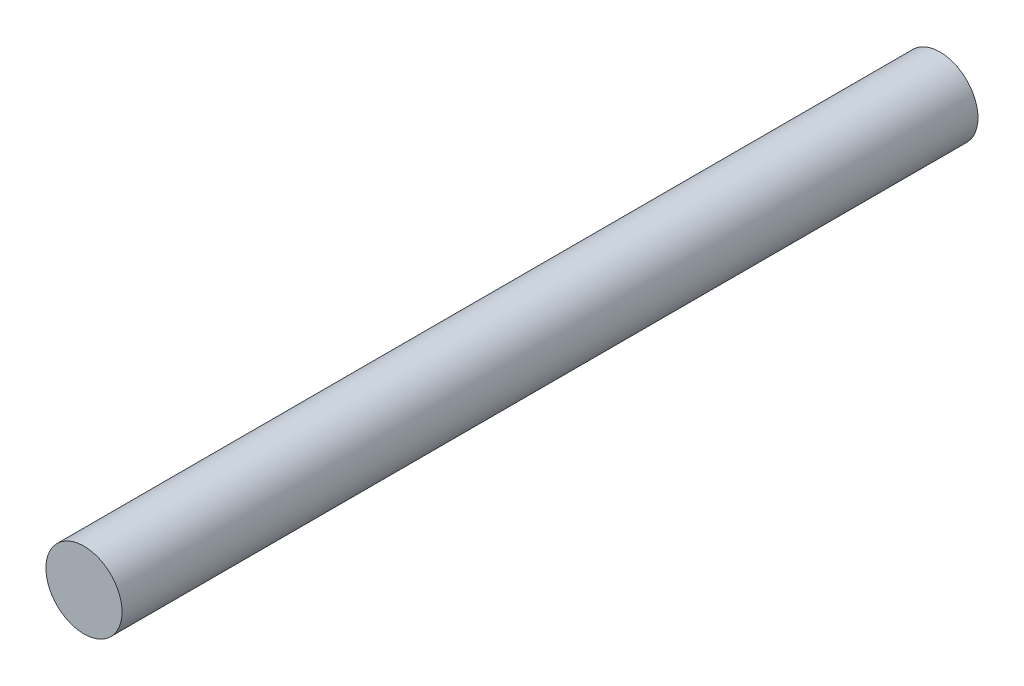
ISO-10303-21;
HEADER;
FILE_DESCRIPTION(('STEP AP214'),'2;1');
FILE_NAME('part.step','',(''),(''),'','','');
FILE_SCHEMA(('AUTOMOTIVE_DESIGN { 1 0 10303 214 1 1 1 1 }'));
ENDSEC;
DATA;
#1=APPLICATION_CONTEXT('core data for automotive mechanical design processes');
#2=APPLICATION_PROTOCOL_DEFINITION('international standard','automotive_design',2000,#1);
#3=PRODUCT_CONTEXT('',#1,'mechanical');
#4=PRODUCT('Part','Part','',(#3));
#5=PRODUCT_RELATED_PRODUCT_CATEGORY('part','',(#4));
#6=PRODUCT_DEFINITION_FORMATION('','',#4);
#7=PRODUCT_DEFINITION_CONTEXT('part definition',#1,'design');
#8=PRODUCT_DEFINITION('design','',#6,#7);
#9=PRODUCT_DEFINITION_SHAPE('','',#8);
#10=(LENGTH_UNIT() NAMED_UNIT(*) SI_UNIT(.MILLI.,.METRE.));
#11=(NAMED_UNIT(*) PLANE_ANGLE_UNIT() SI_UNIT($,.RADIAN.));
#12=(NAMED_UNIT(*) SI_UNIT($,.STERADIAN.) SOLID_ANGLE_UNIT());
#13=UNCERTAINTY_MEASURE_WITH_UNIT(LENGTH_MEASURE(1.E-05),#10,'distance_accuracy_value','');
#14=(GEOMETRIC_REPRESENTATION_CONTEXT(3) GLOBAL_UNCERTAINTY_ASSIGNED_CONTEXT((#13)) GLOBAL_UNIT_ASSIGNED_CONTEXT((#10,
#11,#12)) REPRESENTATION_CONTEXT('',''));
#15=CARTESIAN_POINT('',(0.,0.,0.));
#16=DIRECTION('',(0.,0.,1.));
#17=DIRECTION('',(1.,0.,0.));
#18=AXIS2_PLACEMENT_3D('',#15,#16,#17);
#19=CARTESIAN_POINT('',(0.,0.,112.5));
#20=DIRECTION('',(0.,0.,-1.));
#21=DIRECTION('',(-1.,0.,0.));
#22=AXIS2_PLACEMENT_3D('',#19,#20,#21);
#23=CYLINDRICAL_SURFACE('',#22,10.);
#24=CARTESIAN_POINT('',(0.,0.,112.5));
#25=DIRECTION('',(0.,0.,1.));
#26=DIRECTION('',(1.,0.,0.));
#27=AXIS2_PLACEMENT_3D('',#24,#25,#26);
#28=CIRCLE('',#27,10.);
#29=CARTESIAN_POINT('',(10.,0.,112.5));
#30=VERTEX_POINT('',#29);
#31=EDGE_CURVE('E10',#30,#30,#28,.T.);
#32=ORIENTED_EDGE('',*,*,#31,.F.);
#33=EDGE_LOOP('',(#32));
#34=FACE_BOUND('',#33,.T.);
#35=CARTESIAN_POINT('',(0.,0.,-112.5));
#36=DIRECTION('',(0.,0.,1.));
#37=DIRECTION('',(1.,0.,0.));
#38=AXIS2_PLACEMENT_3D('',#35,#36,#37);
#39=CIRCLE('',#38,10.);
#40=CARTESIAN_POINT('',(10.,0.,-112.5));
#41=VERTEX_POINT('',#40);
#42=EDGE_CURVE('E35',#41,#41,#39,.T.);
#43=ORIENTED_EDGE('',*,*,#42,.T.);
#44=EDGE_LOOP('',(#43));
#45=FACE_BOUND('',#44,.T.);
#46=ADVANCED_FACE('F32',(#34,#45),#23,.T.);
#47=CARTESIAN_POINT('',(0.,0.,112.5));
#48=DIRECTION('',(0.,0.,1.));
#49=DIRECTION('',(1.,0.,0.));
#50=AXIS2_PLACEMENT_3D('',#47,#48,#49);
#51=PLANE('',#50);
#52=ORIENTED_EDGE('',*,*,#31,.T.);
#53=EDGE_LOOP('',(#52));
#54=FACE_BOUND('',#53,.T.);
#55=ADVANCED_FACE('F47',(#54),#51,.T.);
#56=CARTESIAN_POINT('',(0.,0.,-112.5));
#57=DIRECTION('',(0.,0.,1.));
#58=DIRECTION('',(1.,0.,0.));
#59=AXIS2_PLACEMENT_3D('',#56,#57,#58);
#60=PLANE('',#59);
#61=ORIENTED_EDGE('',*,*,#42,.F.);
#62=EDGE_LOOP('',(#61));
#63=FACE_BOUND('',#62,.T.);
#64=ADVANCED_FACE('F45',(#63),#60,.F.);
#65=CLOSED_SHELL('',(#46,#55,#64));
#66=MANIFOLD_SOLID_BREP('B2',#65);
#67=ADVANCED_BREP_SHAPE_REPRESENTATION('',(#18,#66),#14);
#68=SHAPE_DEFINITION_REPRESENTATION(#9,#67);
ENDSEC;
END-ISO-10303-21;
